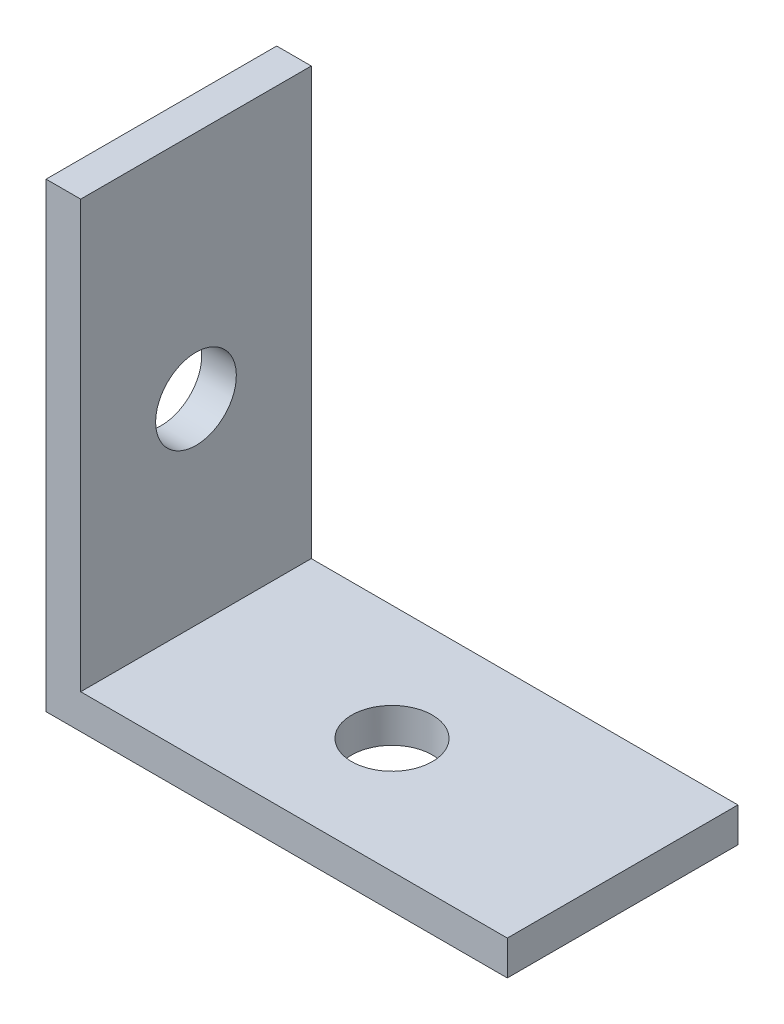
ISO-10303-21;
HEADER;
FILE_DESCRIPTION(('STEP AP214'),'2;1');
FILE_NAME('part.step','',(''),(''),'','','');
FILE_SCHEMA(('AUTOMOTIVE_DESIGN { 1 0 10303 214 1 1 1 1 }'));
ENDSEC;
DATA;
#1=APPLICATION_CONTEXT('core data for automotive mechanical design processes');
#2=APPLICATION_PROTOCOL_DEFINITION('international standard','automotive_design',2000,#1);
#3=PRODUCT_CONTEXT('',#1,'mechanical');
#4=PRODUCT('Part','Part','',(#3));
#5=PRODUCT_RELATED_PRODUCT_CATEGORY('part','',(#4));
#6=PRODUCT_DEFINITION_FORMATION('','',#4);
#7=PRODUCT_DEFINITION_CONTEXT('part definition',#1,'design');
#8=PRODUCT_DEFINITION('design','',#6,#7);
#9=PRODUCT_DEFINITION_SHAPE('','',#8);
#10=(LENGTH_UNIT() NAMED_UNIT(*) SI_UNIT(.MILLI.,.METRE.));
#11=(NAMED_UNIT(*) PLANE_ANGLE_UNIT() SI_UNIT($,.RADIAN.));
#12=(NAMED_UNIT(*) SI_UNIT($,.STERADIAN.) SOLID_ANGLE_UNIT());
#13=UNCERTAINTY_MEASURE_WITH_UNIT(LENGTH_MEASURE(1.E-05),#10,'distance_accuracy_value','');
#14=(GEOMETRIC_REPRESENTATION_CONTEXT(3) GLOBAL_UNCERTAINTY_ASSIGNED_CONTEXT((#13)) GLOBAL_UNIT_ASSIGNED_CONTEXT((#10,
#11,#12)) REPRESENTATION_CONTEXT('',''));
#15=CARTESIAN_POINT('',(0.,0.,0.));
#16=DIRECTION('',(0.,0.,1.));
#17=DIRECTION('',(1.,0.,0.));
#18=AXIS2_PLACEMENT_3D('',#15,#16,#17);
#19=CARTESIAN_POINT('',(20.,0.,10.));
#20=DIRECTION('',(0.,1.,0.));
#21=DIRECTION('',(-1.,0.,0.));
#22=AXIS2_PLACEMENT_3D('',#19,#20,#21);
#23=PLANE('',#22);
#24=CARTESIAN_POINT('',(10.,0.,5.));
#25=DIRECTION('',(0.,-1.,0.));
#26=DIRECTION('',(1.,0.,0.));
#27=AXIS2_PLACEMENT_3D('',#24,#25,#26);
#28=CIRCLE('',#27,1.75);
#29=CARTESIAN_POINT('',(11.75,0.,5.));
#30=VERTEX_POINT('',#29);
#31=EDGE_CURVE('E163',#30,#30,#28,.T.);
#32=ORIENTED_EDGE('',*,*,#31,.F.);
#33=EDGE_LOOP('',(#32));
#34=FACE_BOUND('',#33,.T.);
#35=DIRECTION('',(1.,0.,0.));
#36=VECTOR('',#35,1.);
#37=CARTESIAN_POINT('',(20.,0.,0.));
#38=LINE('',#37,#36);
#39=CARTESIAN_POINT('',(0.,0.,0.));
#40=VERTEX_POINT('',#39);
#41=CARTESIAN_POINT('',(20.,0.,0.));
#42=VERTEX_POINT('',#41);
#43=EDGE_CURVE('E119',#40,#42,#38,.T.);
#44=ORIENTED_EDGE('',*,*,#43,.T.);
#45=DIRECTION('',(0.,0.,-1.));
#46=VECTOR('',#45,1.);
#47=CARTESIAN_POINT('',(20.,0.,10.));
#48=LINE('',#47,#46);
#49=CARTESIAN_POINT('',(20.,0.,10.));
#50=VERTEX_POINT('',#49);
#51=EDGE_CURVE('E11',#50,#42,#48,.T.);
#52=ORIENTED_EDGE('',*,*,#51,.F.);
#53=DIRECTION('',(1.,0.,0.));
#54=VECTOR('',#53,1.);
#55=CARTESIAN_POINT('',(20.,0.,10.));
#56=LINE('',#55,#54);
#57=CARTESIAN_POINT('',(0.,0.,10.));
#58=VERTEX_POINT('',#57);
#59=EDGE_CURVE('E130',#58,#50,#56,.T.);
#60=ORIENTED_EDGE('',*,*,#59,.F.);
#61=DIRECTION('',(0.,0.,-1.));
#62=VECTOR('',#61,1.);
#63=CARTESIAN_POINT('',(0.,0.,10.));
#64=LINE('',#63,#62);
#65=EDGE_CURVE('E115',#58,#40,#64,.T.);
#66=ORIENTED_EDGE('',*,*,#65,.T.);
#67=EDGE_LOOP('',(#44,#52,#60,#66));
#68=FACE_BOUND('',#67,.T.);
#69=ADVANCED_FACE('F35',(#34,#68),#23,.F.);
#70=CARTESIAN_POINT('',(20.,1.5,10.));
#71=DIRECTION('',(-1.,0.,0.));
#72=DIRECTION('',(0.,0.,1.));
#73=AXIS2_PLACEMENT_3D('',#70,#71,#72);
#74=PLANE('',#73);
#75=DIRECTION('',(0.,1.,0.));
#76=VECTOR('',#75,1.);
#77=CARTESIAN_POINT('',(20.,1.5,0.));
#78=LINE('',#77,#76);
#79=CARTESIAN_POINT('',(20.,1.5,0.));
#80=VERTEX_POINT('',#79);
#81=EDGE_CURVE('E122',#42,#80,#78,.T.);
#82=ORIENTED_EDGE('',*,*,#81,.T.);
#83=DIRECTION('',(0.,0.,-1.));
#84=VECTOR('',#83,1.);
#85=CARTESIAN_POINT('',(20.,1.5,10.));
#86=LINE('',#85,#84);
#87=CARTESIAN_POINT('',(20.,1.5,10.));
#88=VERTEX_POINT('',#87);
#89=EDGE_CURVE('E43',#88,#80,#86,.T.);
#90=ORIENTED_EDGE('',*,*,#89,.F.);
#91=DIRECTION('',(0.,1.,0.));
#92=VECTOR('',#91,1.);
#93=CARTESIAN_POINT('',(20.,1.5,10.));
#94=LINE('',#93,#92);
#95=EDGE_CURVE('E88',#50,#88,#94,.T.);
#96=ORIENTED_EDGE('',*,*,#95,.F.);
#97=ORIENTED_EDGE('',*,*,#51,.T.);
#98=EDGE_LOOP('',(#82,#90,#96,#97));
#99=FACE_BOUND('',#98,.T.);
#100=ADVANCED_FACE('F156',(#99),#74,.F.);
#101=CARTESIAN_POINT('',(1.5,1.5,10.));
#102=DIRECTION('',(0.,-1.,0.));
#103=DIRECTION('',(0.,0.,-1.));
#104=AXIS2_PLACEMENT_3D('',#101,#102,#103);
#105=PLANE('',#104);
#106=CARTESIAN_POINT('',(10.,1.5,5.));
#107=DIRECTION('',(0.,-1.,0.));
#108=DIRECTION('',(0.,0.,-1.));
#109=AXIS2_PLACEMENT_3D('',#106,#107,#108);
#110=CIRCLE('',#109,1.75);
#111=CARTESIAN_POINT('',(10.,1.5,3.25));
#112=VERTEX_POINT('',#111);
#113=EDGE_CURVE('E123',#112,#112,#110,.F.);
#114=ORIENTED_EDGE('',*,*,#113,.F.);
#115=EDGE_LOOP('',(#114));
#116=FACE_BOUND('',#115,.T.);
#117=DIRECTION('',(-1.,0.,0.));
#118=VECTOR('',#117,1.);
#119=CARTESIAN_POINT('',(1.5,1.5,0.));
#120=LINE('',#119,#118);
#121=CARTESIAN_POINT('',(1.5,1.5,0.));
#122=VERTEX_POINT('',#121);
#123=EDGE_CURVE('E125',#80,#122,#120,.T.);
#124=ORIENTED_EDGE('',*,*,#123,.T.);
#125=DIRECTION('',(0.,0.,-1.));
#126=VECTOR('',#125,1.);
#127=CARTESIAN_POINT('',(1.5,1.5,10.));
#128=LINE('',#127,#126);
#129=CARTESIAN_POINT('',(1.5,1.5,10.));
#130=VERTEX_POINT('',#129);
#131=EDGE_CURVE('E110',#130,#122,#128,.T.);
#132=ORIENTED_EDGE('',*,*,#131,.F.);
#133=DIRECTION('',(-1.,0.,0.));
#134=VECTOR('',#133,1.);
#135=CARTESIAN_POINT('',(1.5,1.5,10.));
#136=LINE('',#135,#134);
#137=EDGE_CURVE('E101',#88,#130,#136,.T.);
#138=ORIENTED_EDGE('',*,*,#137,.F.);
#139=ORIENTED_EDGE('',*,*,#89,.T.);
#140=EDGE_LOOP('',(#124,#132,#138,#139));
#141=FACE_BOUND('',#140,.T.);
#142=ADVANCED_FACE('F136',(#116,#141),#105,.F.);
#143=CARTESIAN_POINT('',(1.5,20.,10.));
#144=DIRECTION('',(-1.,0.,0.));
#145=DIRECTION('',(0.,-1.,0.));
#146=AXIS2_PLACEMENT_3D('',#143,#144,#145);
#147=PLANE('',#146);
#148=CARTESIAN_POINT('',(1.5,10.,5.));
#149=DIRECTION('',(-1.,0.,0.));
#150=DIRECTION('',(0.,-1.,0.));
#151=AXIS2_PLACEMENT_3D('',#148,#149,#150);
#152=CIRCLE('',#151,1.75);
#153=CARTESIAN_POINT('',(1.5,8.25,5.));
#154=VERTEX_POINT('',#153);
#155=EDGE_CURVE('E169',#154,#154,#152,.T.);
#156=ORIENTED_EDGE('',*,*,#155,.T.);
#157=EDGE_LOOP('',(#156));
#158=FACE_BOUND('',#157,.T.);
#159=DIRECTION('',(0.,1.,0.));
#160=VECTOR('',#159,1.);
#161=CARTESIAN_POINT('',(1.5,20.,0.));
#162=LINE('',#161,#160);
#163=CARTESIAN_POINT('',(1.5,20.,0.));
#164=VERTEX_POINT('',#163);
#165=EDGE_CURVE('E109',#122,#164,#162,.T.);
#166=ORIENTED_EDGE('',*,*,#165,.T.);
#167=DIRECTION('',(0.,0.,-1.));
#168=VECTOR('',#167,1.);
#169=CARTESIAN_POINT('',(1.5,20.,10.));
#170=LINE('',#169,#168);
#171=CARTESIAN_POINT('',(1.5,20.,10.));
#172=VERTEX_POINT('',#171);
#173=EDGE_CURVE('E106',#172,#164,#170,.T.);
#174=ORIENTED_EDGE('',*,*,#173,.F.);
#175=DIRECTION('',(0.,1.,0.));
#176=VECTOR('',#175,1.);
#177=CARTESIAN_POINT('',(1.5,20.,10.));
#178=LINE('',#177,#176);
#179=EDGE_CURVE('E95',#130,#172,#178,.T.);
#180=ORIENTED_EDGE('',*,*,#179,.F.);
#181=ORIENTED_EDGE('',*,*,#131,.T.);
#182=EDGE_LOOP('',(#166,#174,#180,#181));
#183=FACE_BOUND('',#182,.T.);
#184=ADVANCED_FACE('F107',(#158,#183),#147,.F.);
#185=CARTESIAN_POINT('',(0.,20.,10.));
#186=DIRECTION('',(0.,-1.,0.));
#187=DIRECTION('',(0.,0.,-1.));
#188=AXIS2_PLACEMENT_3D('',#185,#186,#187);
#189=PLANE('',#188);
#190=DIRECTION('',(-1.,0.,0.));
#191=VECTOR('',#190,1.);
#192=CARTESIAN_POINT('',(0.,20.,0.));
#193=LINE('',#192,#191);
#194=CARTESIAN_POINT('',(0.,20.,0.));
#195=VERTEX_POINT('',#194);
#196=EDGE_CURVE('E74',#164,#195,#193,.T.);
#197=ORIENTED_EDGE('',*,*,#196,.T.);
#198=DIRECTION('',(0.,0.,-1.));
#199=VECTOR('',#198,1.);
#200=CARTESIAN_POINT('',(0.,20.,10.));
#201=LINE('',#200,#199);
#202=CARTESIAN_POINT('',(0.,20.,10.));
#203=VERTEX_POINT('',#202);
#204=EDGE_CURVE('E111',#203,#195,#201,.T.);
#205=ORIENTED_EDGE('',*,*,#204,.F.);
#206=DIRECTION('',(-1.,0.,0.));
#207=VECTOR('',#206,1.);
#208=CARTESIAN_POINT('',(0.,20.,10.));
#209=LINE('',#208,#207);
#210=EDGE_CURVE('E99',#172,#203,#209,.T.);
#211=ORIENTED_EDGE('',*,*,#210,.F.);
#212=ORIENTED_EDGE('',*,*,#173,.T.);
#213=EDGE_LOOP('',(#197,#205,#211,#212));
#214=FACE_BOUND('',#213,.T.);
#215=ADVANCED_FACE('F113',(#214),#189,.F.);
#216=CARTESIAN_POINT('',(0.,0.,10.));
#217=DIRECTION('',(1.,0.,0.));
#218=DIRECTION('',(0.,0.,-1.));
#219=AXIS2_PLACEMENT_3D('',#216,#217,#218);
#220=PLANE('',#219);
#221=CARTESIAN_POINT('',(0.,10.,5.));
#222=DIRECTION('',(1.,0.,0.));
#223=DIRECTION('',(0.,1.,0.));
#224=AXIS2_PLACEMENT_3D('',#221,#222,#223);
#225=CIRCLE('',#224,1.75);
#226=CARTESIAN_POINT('',(0.,11.75,5.));
#227=VERTEX_POINT('',#226);
#228=EDGE_CURVE('E165',#227,#227,#225,.T.);
#229=ORIENTED_EDGE('',*,*,#228,.T.);
#230=EDGE_LOOP('',(#229));
#231=FACE_BOUND('',#230,.T.);
#232=DIRECTION('',(0.,-1.,0.));
#233=VECTOR('',#232,1.);
#234=CARTESIAN_POINT('',(0.,0.,0.));
#235=LINE('',#234,#233);
#236=EDGE_CURVE('E80',#195,#40,#235,.T.);
#237=ORIENTED_EDGE('',*,*,#236,.T.);
#238=ORIENTED_EDGE('',*,*,#65,.F.);
#239=DIRECTION('',(0.,-1.,0.));
#240=VECTOR('',#239,1.);
#241=CARTESIAN_POINT('',(0.,0.,10.));
#242=LINE('',#241,#240);
#243=EDGE_CURVE('E51',#203,#58,#242,.T.);
#244=ORIENTED_EDGE('',*,*,#243,.F.);
#245=ORIENTED_EDGE('',*,*,#204,.T.);
#246=EDGE_LOOP('',(#237,#238,#244,#245));
#247=FACE_BOUND('',#246,.T.);
#248=ADVANCED_FACE('F143',(#231,#247),#220,.F.);
#249=CARTESIAN_POINT('',(0.,0.,10.));
#250=DIRECTION('',(0.,0.,-1.));
#251=DIRECTION('',(-1.,0.,0.));
#252=AXIS2_PLACEMENT_3D('',#249,#250,#251);
#253=PLANE('',#252);
#254=ORIENTED_EDGE('',*,*,#59,.T.);
#255=ORIENTED_EDGE('',*,*,#95,.T.);
#256=ORIENTED_EDGE('',*,*,#137,.T.);
#257=ORIENTED_EDGE('',*,*,#179,.T.);
#258=ORIENTED_EDGE('',*,*,#210,.T.);
#259=ORIENTED_EDGE('',*,*,#243,.T.);
#260=EDGE_LOOP('',(#254,#255,#256,#257,#258,#259));
#261=FACE_BOUND('',#260,.T.);
#262=ADVANCED_FACE('F97',(#261),#253,.F.);
#263=CARTESIAN_POINT('',(0.,0.,0.));
#264=DIRECTION('',(0.,0.,-1.));
#265=DIRECTION('',(-1.,0.,0.));
#266=AXIS2_PLACEMENT_3D('',#263,#264,#265);
#267=PLANE('',#266);
#268=ORIENTED_EDGE('',*,*,#43,.F.);
#269=ORIENTED_EDGE('',*,*,#236,.F.);
#270=ORIENTED_EDGE('',*,*,#196,.F.);
#271=ORIENTED_EDGE('',*,*,#165,.F.);
#272=ORIENTED_EDGE('',*,*,#123,.F.);
#273=ORIENTED_EDGE('',*,*,#81,.F.);
#274=EDGE_LOOP('',(#268,#269,#270,#271,#272,#273));
#275=FACE_BOUND('',#274,.T.);
#276=ADVANCED_FACE('F139',(#275),#267,.T.);
#277=CARTESIAN_POINT('',(10.,20.001,5.));
#278=DIRECTION('',(0.,-1.,0.));
#279=DIRECTION('',(1.,0.,0.));
#280=AXIS2_PLACEMENT_3D('',#277,#278,#279);
#281=CYLINDRICAL_SURFACE('',#280,1.75);
#282=ORIENTED_EDGE('',*,*,#31,.T.);
#283=EDGE_LOOP('',(#282));
#284=FACE_BOUND('',#283,.T.);
#285=ORIENTED_EDGE('',*,*,#113,.T.);
#286=EDGE_LOOP('',(#285));
#287=FACE_BOUND('',#286,.T.);
#288=ADVANCED_FACE('F180',(#284,#287),#281,.F.);
#289=CARTESIAN_POINT('',(20.001,9.99999999999998,5.));
#290=DIRECTION('',(-1.,0.,0.));
#291=DIRECTION('',(0.,-1.,0.));
#292=AXIS2_PLACEMENT_3D('',#289,#290,#291);
#293=CYLINDRICAL_SURFACE('',#292,1.75);
#294=ORIENTED_EDGE('',*,*,#228,.F.);
#295=EDGE_LOOP('',(#294));
#296=FACE_BOUND('',#295,.T.);
#297=ORIENTED_EDGE('',*,*,#155,.F.);
#298=EDGE_LOOP('',(#297));
#299=FACE_BOUND('',#298,.T.);
#300=ADVANCED_FACE('F178',(#296,#299),#293,.F.);
#301=CLOSED_SHELL('',(#69,#100,#142,#184,#215,#248,#262,#276,#288,#300));
#302=MANIFOLD_SOLID_BREP('B2',#301);
#303=ADVANCED_BREP_SHAPE_REPRESENTATION('',(#18,#302),#14);
#304=SHAPE_DEFINITION_REPRESENTATION(#9,#303);
ENDSEC;
END-ISO-10303-21;
